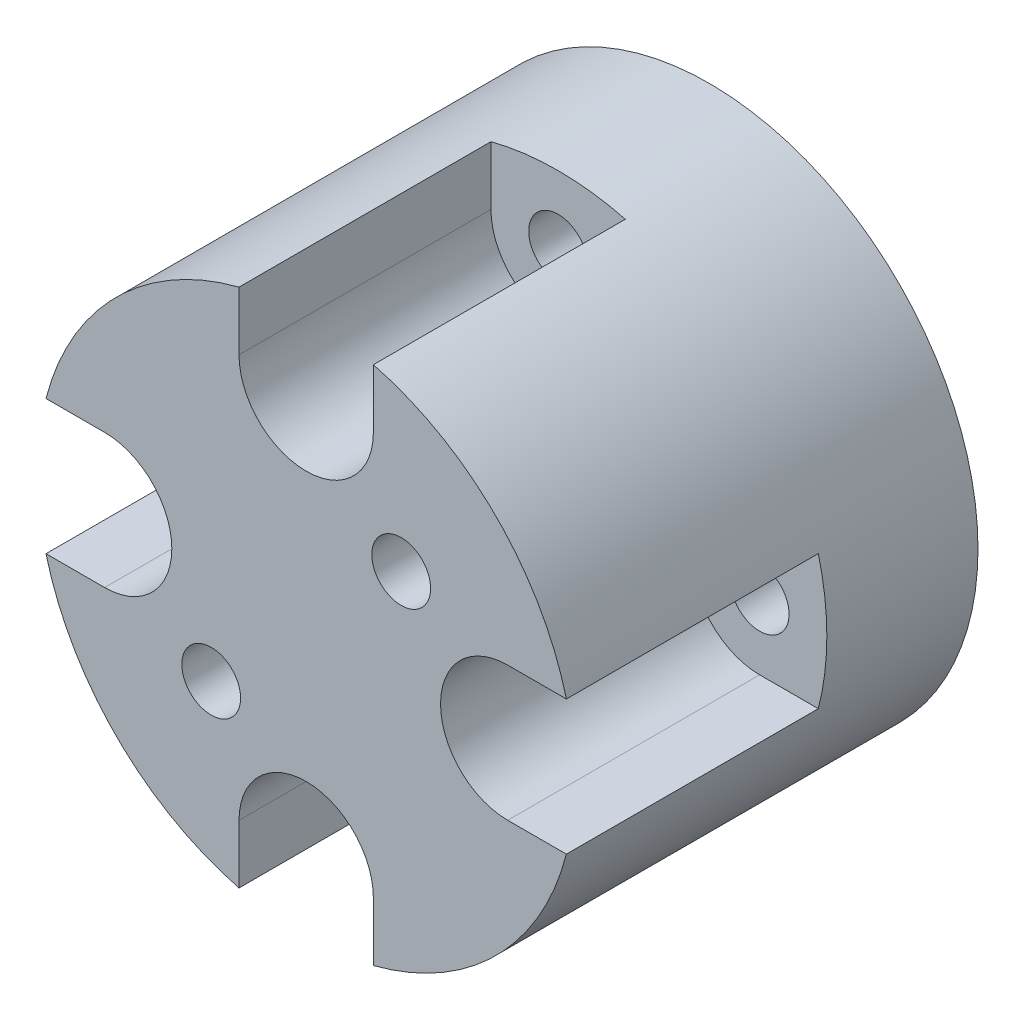
ISO-10303-21;
HEADER;
FILE_DESCRIPTION(('STEP AP214'),'2;1');
FILE_NAME('part.step','',(''),(''),'','','');
FILE_SCHEMA(('AUTOMOTIVE_DESIGN { 1 0 10303 214 1 1 1 1 }'));
ENDSEC;
DATA;
#1=APPLICATION_CONTEXT('core data for automotive mechanical design processes');
#2=APPLICATION_PROTOCOL_DEFINITION('international standard','automotive_design',2000,#1);
#3=PRODUCT_CONTEXT('',#1,'mechanical');
#4=PRODUCT('Part','Part','',(#3));
#5=PRODUCT_RELATED_PRODUCT_CATEGORY('part','',(#4));
#6=PRODUCT_DEFINITION_FORMATION('','',#4);
#7=PRODUCT_DEFINITION_CONTEXT('part definition',#1,'design');
#8=PRODUCT_DEFINITION('design','',#6,#7);
#9=PRODUCT_DEFINITION_SHAPE('','',#8);
#10=(LENGTH_UNIT() NAMED_UNIT(*) SI_UNIT(.MILLI.,.METRE.));
#11=(NAMED_UNIT(*) PLANE_ANGLE_UNIT() SI_UNIT($,.RADIAN.));
#12=(NAMED_UNIT(*) SI_UNIT($,.STERADIAN.) SOLID_ANGLE_UNIT());
#13=UNCERTAINTY_MEASURE_WITH_UNIT(LENGTH_MEASURE(1.E-05),#10,'distance_accuracy_value','');
#14=(GEOMETRIC_REPRESENTATION_CONTEXT(3) GLOBAL_UNCERTAINTY_ASSIGNED_CONTEXT((#13)) GLOBAL_UNIT_ASSIGNED_CONTEXT((#10,
#11,#12)) REPRESENTATION_CONTEXT('',''));
#15=CARTESIAN_POINT('',(0.,0.,0.));
#16=DIRECTION('',(0.,0.,1.));
#17=DIRECTION('',(1.,0.,0.));
#18=AXIS2_PLACEMENT_3D('',#15,#16,#17);
#19=CARTESIAN_POINT('',(0.,12.,24.));
#20=DIRECTION('',(0.,0.,-1.));
#21=DIRECTION('',(-1.,0.,0.));
#22=AXIS2_PLACEMENT_3D('',#19,#20,#21);
#23=CYLINDRICAL_SURFACE('',#22,1.75);
#24=CARTESIAN_POINT('',(0.,12.,0.));
#25=DIRECTION('',(0.,0.,1.));
#26=DIRECTION('',(1.,0.,0.));
#27=AXIS2_PLACEMENT_3D('',#24,#25,#26);
#28=CIRCLE('',#27,1.75);
#29=CARTESIAN_POINT('',(1.75,12.,0.));
#30=VERTEX_POINT('',#29);
#31=EDGE_CURVE('E275',#30,#30,#28,.T.);
#32=ORIENTED_EDGE('',*,*,#31,.F.);
#33=EDGE_LOOP('',(#32));
#34=FACE_BOUND('',#33,.T.);
#35=CARTESIAN_POINT('',(0.,12.,9.));
#36=DIRECTION('',(0.,0.,1.));
#37=DIRECTION('',(1.,0.,0.));
#38=AXIS2_PLACEMENT_3D('',#35,#36,#37);
#39=CIRCLE('',#38,1.75);
#40=CARTESIAN_POINT('',(1.75,12.,9.));
#41=VERTEX_POINT('',#40);
#42=EDGE_CURVE('E243',#41,#41,#39,.T.);
#43=ORIENTED_EDGE('',*,*,#42,.T.);
#44=EDGE_LOOP('',(#43));
#45=FACE_BOUND('',#44,.T.);
#46=ADVANCED_FACE('F37',(#34,#45),#23,.F.);
#47=CARTESIAN_POINT('',(12.,0.,24.));
#48=DIRECTION('',(0.,0.,-1.));
#49=DIRECTION('',(-1.,0.,0.));
#50=AXIS2_PLACEMENT_3D('',#47,#48,#49);
#51=CYLINDRICAL_SURFACE('',#50,1.75);
#52=CARTESIAN_POINT('',(12.,0.,0.));
#53=DIRECTION('',(0.,0.,1.));
#54=DIRECTION('',(1.,0.,0.));
#55=AXIS2_PLACEMENT_3D('',#52,#53,#54);
#56=CIRCLE('',#55,1.75);
#57=CARTESIAN_POINT('',(13.75,0.,0.));
#58=VERTEX_POINT('',#57);
#59=EDGE_CURVE('E272',#58,#58,#56,.T.);
#60=ORIENTED_EDGE('',*,*,#59,.F.);
#61=EDGE_LOOP('',(#60));
#62=FACE_BOUND('',#61,.T.);
#63=CARTESIAN_POINT('',(12.,0.,9.));
#64=DIRECTION('',(0.,0.,1.));
#65=DIRECTION('',(1.,0.,0.));
#66=AXIS2_PLACEMENT_3D('',#63,#64,#65);
#67=CIRCLE('',#66,1.75);
#68=CARTESIAN_POINT('',(13.75,0.,9.));
#69=VERTEX_POINT('',#68);
#70=EDGE_CURVE('E240',#69,#69,#67,.T.);
#71=ORIENTED_EDGE('',*,*,#70,.T.);
#72=EDGE_LOOP('',(#71));
#73=FACE_BOUND('',#72,.T.);
#74=ADVANCED_FACE('F386',(#62,#73),#51,.F.);
#75=CARTESIAN_POINT('',(-12.,0.,24.));
#76=DIRECTION('',(0.,0.,-1.));
#77=DIRECTION('',(-1.,0.,0.));
#78=AXIS2_PLACEMENT_3D('',#75,#76,#77);
#79=CYLINDRICAL_SURFACE('',#78,1.75);
#80=CARTESIAN_POINT('',(-12.,0.,0.));
#81=DIRECTION('',(0.,0.,1.));
#82=DIRECTION('',(-1.,0.,0.));
#83=AXIS2_PLACEMENT_3D('',#80,#81,#82);
#84=CIRCLE('',#83,1.75);
#85=CARTESIAN_POINT('',(-13.75,0.,0.));
#86=VERTEX_POINT('',#85);
#87=EDGE_CURVE('E269',#86,#86,#84,.T.);
#88=ORIENTED_EDGE('',*,*,#87,.F.);
#89=EDGE_LOOP('',(#88));
#90=FACE_BOUND('',#89,.T.);
#91=CARTESIAN_POINT('',(-12.,0.,9.));
#92=DIRECTION('',(0.,0.,1.));
#93=DIRECTION('',(1.,0.,0.));
#94=AXIS2_PLACEMENT_3D('',#91,#92,#93);
#95=CIRCLE('',#94,1.75);
#96=CARTESIAN_POINT('',(-10.25,0.,9.));
#97=VERTEX_POINT('',#96);
#98=EDGE_CURVE('E237',#97,#97,#95,.T.);
#99=ORIENTED_EDGE('',*,*,#98,.T.);
#100=EDGE_LOOP('',(#99));
#101=FACE_BOUND('',#100,.T.);
#102=ADVANCED_FACE('F392',(#90,#101),#79,.F.);
#103=CARTESIAN_POINT('',(0.,-12.,24.));
#104=DIRECTION('',(0.,0.,-1.));
#105=DIRECTION('',(-1.,0.,0.));
#106=AXIS2_PLACEMENT_3D('',#103,#104,#105);
#107=CYLINDRICAL_SURFACE('',#106,1.75);
#108=CARTESIAN_POINT('',(0.,-12.,0.));
#109=DIRECTION('',(0.,0.,1.));
#110=DIRECTION('',(-1.,0.,0.));
#111=AXIS2_PLACEMENT_3D('',#108,#109,#110);
#112=CIRCLE('',#111,1.75);
#113=CARTESIAN_POINT('',(-1.75,-12.,0.));
#114=VERTEX_POINT('',#113);
#115=EDGE_CURVE('E262',#114,#114,#112,.T.);
#116=ORIENTED_EDGE('',*,*,#115,.F.);
#117=EDGE_LOOP('',(#116));
#118=FACE_BOUND('',#117,.T.);
#119=CARTESIAN_POINT('',(0.,-12.,9.));
#120=DIRECTION('',(0.,0.,1.));
#121=DIRECTION('',(1.,0.,0.));
#122=AXIS2_PLACEMENT_3D('',#119,#120,#121);
#123=CIRCLE('',#122,1.75);
#124=CARTESIAN_POINT('',(1.75,-12.,9.));
#125=VERTEX_POINT('',#124);
#126=EDGE_CURVE('E179',#125,#125,#123,.T.);
#127=ORIENTED_EDGE('',*,*,#126,.T.);
#128=EDGE_LOOP('',(#127));
#129=FACE_BOUND('',#128,.T.);
#130=ADVANCED_FACE('F421',(#118,#129),#107,.F.);
#131=CARTESIAN_POINT('',(-5.65685424949241,-5.65685424949235,24.));
#132=DIRECTION('',(0.,0.,-1.));
#133=DIRECTION('',(-1.,0.,0.));
#134=AXIS2_PLACEMENT_3D('',#131,#132,#133);
#135=CYLINDRICAL_SURFACE('',#134,1.75);
#136=CARTESIAN_POINT('',(-5.65685424949241,-5.65685424949235,24.));
#137=DIRECTION('',(0.,0.,-1.));
#138=DIRECTION('',(1.,0.,0.));
#139=AXIS2_PLACEMENT_3D('',#136,#137,#138);
#140=CIRCLE('',#139,1.75);
#141=CARTESIAN_POINT('',(-3.90685424949241,-5.65685424949235,24.));
#142=VERTEX_POINT('',#141);
#143=EDGE_CURVE('E263',#142,#142,#140,.T.);
#144=ORIENTED_EDGE('',*,*,#143,.F.);
#145=EDGE_LOOP('',(#144));
#146=FACE_BOUND('',#145,.T.);
#147=CARTESIAN_POINT('',(-5.65685424949241,-5.65685424949235,15.));
#148=DIRECTION('',(0.,0.,-1.));
#149=DIRECTION('',(-1.,0.,0.));
#150=AXIS2_PLACEMENT_3D('',#147,#148,#149);
#151=CIRCLE('',#150,1.75);
#152=CARTESIAN_POINT('',(-7.40685424949241,-5.65685424949235,15.));
#153=VERTEX_POINT('',#152);
#154=EDGE_CURVE('E266',#153,#153,#151,.F.);
#155=ORIENTED_EDGE('',*,*,#154,.F.);
#156=EDGE_LOOP('',(#155));
#157=FACE_BOUND('',#156,.T.);
#158=ADVANCED_FACE('F424',(#146,#157),#135,.F.);
#159=CARTESIAN_POINT('',(5.65685424949241,5.65685424949235,24.));
#160=DIRECTION('',(0.,0.,-1.));
#161=DIRECTION('',(-1.,0.,0.));
#162=AXIS2_PLACEMENT_3D('',#159,#160,#161);
#163=CYLINDRICAL_SURFACE('',#162,1.75);
#164=CARTESIAN_POINT('',(5.65685424949241,5.65685424949235,24.));
#165=DIRECTION('',(0.,0.,-1.));
#166=DIRECTION('',(-1.,0.,0.));
#167=AXIS2_PLACEMENT_3D('',#164,#165,#166);
#168=CIRCLE('',#167,1.75);
#169=CARTESIAN_POINT('',(3.90685424949241,5.65685424949235,24.));
#170=VERTEX_POINT('',#169);
#171=EDGE_CURVE('E259',#170,#170,#168,.T.);
#172=ORIENTED_EDGE('',*,*,#171,.F.);
#173=EDGE_LOOP('',(#172));
#174=FACE_BOUND('',#173,.T.);
#175=CARTESIAN_POINT('',(5.65685424949241,5.65685424949235,15.));
#176=DIRECTION('',(0.,0.,-1.));
#177=DIRECTION('',(-1.,0.,0.));
#178=AXIS2_PLACEMENT_3D('',#175,#176,#177);
#179=CIRCLE('',#178,1.75);
#180=CARTESIAN_POINT('',(3.90685424949241,5.65685424949235,15.));
#181=VERTEX_POINT('',#180);
#182=EDGE_CURVE('E250',#181,#181,#179,.F.);
#183=ORIENTED_EDGE('',*,*,#182,.F.);
#184=EDGE_LOOP('',(#183));
#185=FACE_BOUND('',#184,.T.);
#186=ADVANCED_FACE('F401',(#174,#185),#163,.F.);
#187=CARTESIAN_POINT('',(0.,0.,24.));
#188=DIRECTION('',(0.,0.,1.));
#189=DIRECTION('',(1.,0.,0.));
#190=AXIS2_PLACEMENT_3D('',#187,#188,#189);
#191=PLANE('',#190);
#192=DIRECTION('',(0.,-1.,0.));
#193=VECTOR('',#192,1.);
#194=CARTESIAN_POINT('',(-4.,12.,24.));
#195=LINE('',#194,#193);
#196=CARTESIAN_POINT('',(-4.,15.4919333848297,24.));
#197=VERTEX_POINT('',#196);
#198=CARTESIAN_POINT('',(-4.,12.,24.));
#199=VERTEX_POINT('',#198);
#200=EDGE_CURVE('E170',#197,#199,#195,.T.);
#201=ORIENTED_EDGE('',*,*,#200,.F.);
#202=CARTESIAN_POINT('',(0.,0.,24.));
#203=DIRECTION('',(0.,0.,1.));
#204=DIRECTION('',(1.,0.,0.));
#205=AXIS2_PLACEMENT_3D('',#202,#203,#204);
#206=CIRCLE('',#205,16.);
#207=CARTESIAN_POINT('',(-15.4919333848297,4.,24.));
#208=VERTEX_POINT('',#207);
#209=EDGE_CURVE('E283',#197,#208,#206,.T.);
#210=ORIENTED_EDGE('',*,*,#209,.T.);
#211=DIRECTION('',(-1.,0.,0.));
#212=VECTOR('',#211,1.);
#213=CARTESIAN_POINT('',(-12.,4.,24.));
#214=LINE('',#213,#212);
#215=CARTESIAN_POINT('',(-12.,4.,24.));
#216=VERTEX_POINT('',#215);
#217=EDGE_CURVE('E207',#216,#208,#214,.T.);
#218=ORIENTED_EDGE('',*,*,#217,.F.);
#219=CARTESIAN_POINT('',(-12.,0.,24.));
#220=DIRECTION('',(0.,0.,1.));
#221=DIRECTION('',(1.,0.,0.));
#222=AXIS2_PLACEMENT_3D('',#219,#220,#221);
#223=CIRCLE('',#222,4.);
#224=CARTESIAN_POINT('',(-12.,-4.,24.));
#225=VERTEX_POINT('',#224);
#226=EDGE_CURVE('E187',#225,#216,#223,.T.);
#227=ORIENTED_EDGE('',*,*,#226,.F.);
#228=DIRECTION('',(1.,0.,0.));
#229=VECTOR('',#228,1.);
#230=CARTESIAN_POINT('',(-20.86066391594,-4.,24.));
#231=LINE('',#230,#229);
#232=CARTESIAN_POINT('',(-15.4919333848297,-4.,24.));
#233=VERTEX_POINT('',#232);
#234=EDGE_CURVE('E205',#233,#225,#231,.T.);
#235=ORIENTED_EDGE('',*,*,#234,.F.);
#236=CARTESIAN_POINT('',(-4.,-15.4919333848297,24.));
#237=VERTEX_POINT('',#236);
#238=EDGE_CURVE('E340',#233,#237,#206,.T.);
#239=ORIENTED_EDGE('',*,*,#238,.T.);
#240=DIRECTION('',(0.,-1.,0.));
#241=VECTOR('',#240,1.);
#242=CARTESIAN_POINT('',(-4.,-12.,24.));
#243=LINE('',#242,#241);
#244=CARTESIAN_POINT('',(-4.,-12.,24.));
#245=VERTEX_POINT('',#244);
#246=EDGE_CURVE('E225',#245,#237,#243,.T.);
#247=ORIENTED_EDGE('',*,*,#246,.F.);
#248=CARTESIAN_POINT('',(0.,-12.,24.));
#249=DIRECTION('',(0.,0.,1.));
#250=DIRECTION('',(1.,0.,0.));
#251=AXIS2_PLACEMENT_3D('',#248,#249,#250);
#252=CIRCLE('',#251,4.);
#253=CARTESIAN_POINT('',(4.,-12.,24.));
#254=VERTEX_POINT('',#253);
#255=EDGE_CURVE('E204',#254,#245,#252,.T.);
#256=ORIENTED_EDGE('',*,*,#255,.F.);
#257=DIRECTION('',(0.,1.,0.));
#258=VECTOR('',#257,1.);
#259=CARTESIAN_POINT('',(4.,-17.6097461429467,24.));
#260=LINE('',#259,#258);
#261=CARTESIAN_POINT('',(4.,-15.4919333848297,24.));
#262=VERTEX_POINT('',#261);
#263=EDGE_CURVE('E223',#262,#254,#260,.T.);
#264=ORIENTED_EDGE('',*,*,#263,.F.);
#265=CARTESIAN_POINT('',(15.4919333848297,-4.,24.));
#266=VERTEX_POINT('',#265);
#267=EDGE_CURVE('E284',#262,#266,#206,.T.);
#268=ORIENTED_EDGE('',*,*,#267,.T.);
#269=DIRECTION('',(1.,0.,0.));
#270=VECTOR('',#269,1.);
#271=CARTESIAN_POINT('',(20.3197858187912,-4.,24.));
#272=LINE('',#271,#270);
#273=CARTESIAN_POINT('',(12.,-4.,24.));
#274=VERTEX_POINT('',#273);
#275=EDGE_CURVE('E190',#274,#266,#272,.T.);
#276=ORIENTED_EDGE('',*,*,#275,.F.);
#277=CARTESIAN_POINT('',(12.,0.,24.));
#278=DIRECTION('',(0.,0.,1.));
#279=DIRECTION('',(1.,0.,0.));
#280=AXIS2_PLACEMENT_3D('',#277,#278,#279);
#281=CIRCLE('',#280,4.);
#282=CARTESIAN_POINT('',(12.,4.,24.));
#283=VERTEX_POINT('',#282);
#284=EDGE_CURVE('E177',#283,#274,#281,.T.);
#285=ORIENTED_EDGE('',*,*,#284,.F.);
#286=DIRECTION('',(-1.,0.,0.));
#287=VECTOR('',#286,1.);
#288=CARTESIAN_POINT('',(12.,4.,24.));
#289=LINE('',#288,#287);
#290=CARTESIAN_POINT('',(15.4919333848297,4.,24.));
#291=VERTEX_POINT('',#290);
#292=EDGE_CURVE('E188',#291,#283,#289,.T.);
#293=ORIENTED_EDGE('',*,*,#292,.F.);
#294=CARTESIAN_POINT('',(4.,15.4919333848297,24.));
#295=VERTEX_POINT('',#294);
#296=EDGE_CURVE('E279',#291,#295,#206,.T.);
#297=ORIENTED_EDGE('',*,*,#296,.T.);
#298=DIRECTION('',(0.,1.,0.));
#299=VECTOR('',#298,1.);
#300=CARTESIAN_POINT('',(4.,19.5275321632837,24.));
#301=LINE('',#300,#299);
#302=CARTESIAN_POINT('',(4.,12.,24.));
#303=VERTEX_POINT('',#302);
#304=EDGE_CURVE('E172',#303,#295,#301,.T.);
#305=ORIENTED_EDGE('',*,*,#304,.F.);
#306=CARTESIAN_POINT('',(0.,12.,24.));
#307=DIRECTION('',(0.,0.,1.));
#308=DIRECTION('',(1.,0.,0.));
#309=AXIS2_PLACEMENT_3D('',#306,#307,#308);
#310=CIRCLE('',#309,4.);
#311=EDGE_CURVE('E157',#199,#303,#310,.T.);
#312=ORIENTED_EDGE('',*,*,#311,.F.);
#313=EDGE_LOOP('',(#201,#210,#218,#227,#235,#239,#247,#256,#264,#268,#276,#285,#293,#297,#305,#312));
#314=FACE_BOUND('',#313,.T.);
#315=ORIENTED_EDGE('',*,*,#171,.T.);
#316=EDGE_LOOP('',(#315));
#317=FACE_BOUND('',#316,.T.);
#318=ORIENTED_EDGE('',*,*,#143,.T.);
#319=EDGE_LOOP('',(#318));
#320=FACE_BOUND('',#319,.T.);
#321=ADVANCED_FACE('F322',(#314,#317,#320),#191,.T.);
#322=CARTESIAN_POINT('',(0.,0.,0.));
#323=DIRECTION('',(0.,0.,1.));
#324=DIRECTION('',(1.,0.,0.));
#325=AXIS2_PLACEMENT_3D('',#322,#323,#324);
#326=PLANE('',#325);
#327=CARTESIAN_POINT('',(5.65685424949241,5.65685424949235,0.));
#328=DIRECTION('',(0.,0.,-1.));
#329=DIRECTION('',(-1.,0.,0.));
#330=AXIS2_PLACEMENT_3D('',#327,#328,#329);
#331=CIRCLE('',#330,4.);
#332=CARTESIAN_POINT('',(1.65685424949241,5.65685424949235,0.));
#333=VERTEX_POINT('',#332);
#334=EDGE_CURVE('E251',#333,#333,#331,.T.);
#335=ORIENTED_EDGE('',*,*,#334,.F.);
#336=EDGE_LOOP('',(#335));
#337=FACE_BOUND('',#336,.T.);
#338=CARTESIAN_POINT('',(-5.65685424949241,-5.65685424949235,0.));
#339=DIRECTION('',(0.,0.,-1.));
#340=DIRECTION('',(-1.,0.,0.));
#341=AXIS2_PLACEMENT_3D('',#338,#339,#340);
#342=CIRCLE('',#341,4.);
#343=CARTESIAN_POINT('',(-9.65685424949241,-5.65685424949235,0.));
#344=VERTEX_POINT('',#343);
#345=EDGE_CURVE('E254',#344,#344,#342,.T.);
#346=ORIENTED_EDGE('',*,*,#345,.F.);
#347=EDGE_LOOP('',(#346));
#348=FACE_BOUND('',#347,.T.);
#349=CARTESIAN_POINT('',(0.,0.,0.));
#350=DIRECTION('',(0.,0.,1.));
#351=DIRECTION('',(1.,0.,0.));
#352=AXIS2_PLACEMENT_3D('',#349,#350,#351);
#353=CIRCLE('',#352,16.);
#354=CARTESIAN_POINT('',(16.,0.,0.));
#355=VERTEX_POINT('',#354);
#356=EDGE_CURVE('E278',#355,#355,#353,.T.);
#357=ORIENTED_EDGE('',*,*,#356,.F.);
#358=EDGE_LOOP('',(#357));
#359=FACE_BOUND('',#358,.T.);
#360=ORIENTED_EDGE('',*,*,#31,.T.);
#361=EDGE_LOOP('',(#360));
#362=FACE_BOUND('',#361,.T.);
#363=ORIENTED_EDGE('',*,*,#59,.T.);
#364=EDGE_LOOP('',(#363));
#365=FACE_BOUND('',#364,.T.);
#366=ORIENTED_EDGE('',*,*,#87,.T.);
#367=EDGE_LOOP('',(#366));
#368=FACE_BOUND('',#367,.T.);
#369=ORIENTED_EDGE('',*,*,#115,.T.);
#370=EDGE_LOOP('',(#369));
#371=FACE_BOUND('',#370,.T.);
#372=ADVANCED_FACE('F400',(#337,#348,#359,#362,#365,#368,#371),#326,.F.);
#373=CARTESIAN_POINT('',(0.,0.,24.));
#374=DIRECTION('',(0.,0.,-1.));
#375=DIRECTION('',(-1.,0.,0.));
#376=AXIS2_PLACEMENT_3D('',#373,#374,#375);
#377=CYLINDRICAL_SURFACE('',#376,16.);
#378=ORIENTED_EDGE('',*,*,#209,.F.);
#379=DIRECTION('',(0.,0.,-1.));
#380=VECTOR('',#379,1.);
#381=CARTESIAN_POINT('',(-4.,15.4919333848297,24.));
#382=LINE('',#381,#380);
#383=CARTESIAN_POINT('',(-4.,15.4919333848297,9.));
#384=VERTEX_POINT('',#383);
#385=EDGE_CURVE('E11',#197,#384,#382,.T.);
#386=ORIENTED_EDGE('',*,*,#385,.T.);
#387=CARTESIAN_POINT('',(0.,0.,9.));
#388=DIRECTION('',(0.,0.,1.));
#389=DIRECTION('',(1.,0.,0.));
#390=AXIS2_PLACEMENT_3D('',#387,#388,#389);
#391=CIRCLE('',#390,16.);
#392=CARTESIAN_POINT('',(4.,15.4919333848297,9.));
#393=VERTEX_POINT('',#392);
#394=EDGE_CURVE('E244',#393,#384,#391,.T.);
#395=ORIENTED_EDGE('',*,*,#394,.F.);
#396=DIRECTION('',(0.,0.,-1.));
#397=VECTOR('',#396,1.);
#398=CARTESIAN_POINT('',(4.,15.4919333848297,24.));
#399=LINE('',#398,#397);
#400=EDGE_CURVE('E45',#393,#295,#399,.F.);
#401=ORIENTED_EDGE('',*,*,#400,.T.);
#402=ORIENTED_EDGE('',*,*,#296,.F.);
#403=DIRECTION('',(0.,0.,-1.));
#404=VECTOR('',#403,1.);
#405=CARTESIAN_POINT('',(15.4919333848297,4.,24.));
#406=LINE('',#405,#404);
#407=CARTESIAN_POINT('',(15.4919333848297,4.,9.));
#408=VERTEX_POINT('',#407);
#409=EDGE_CURVE('E313',#291,#408,#406,.T.);
#410=ORIENTED_EDGE('',*,*,#409,.T.);
#411=CARTESIAN_POINT('',(0.,0.,9.));
#412=DIRECTION('',(0.,0.,1.));
#413=DIRECTION('',(1.,0.,0.));
#414=AXIS2_PLACEMENT_3D('',#411,#412,#413);
#415=CIRCLE('',#414,16.);
#416=CARTESIAN_POINT('',(15.4919333848297,-4.,9.));
#417=VERTEX_POINT('',#416);
#418=EDGE_CURVE('E241',#417,#408,#415,.T.);
#419=ORIENTED_EDGE('',*,*,#418,.F.);
#420=DIRECTION('',(0.,0.,-1.));
#421=VECTOR('',#420,1.);
#422=CARTESIAN_POINT('',(15.4919333848297,-4.,24.));
#423=LINE('',#422,#421);
#424=EDGE_CURVE('E310',#417,#266,#423,.F.);
#425=ORIENTED_EDGE('',*,*,#424,.T.);
#426=ORIENTED_EDGE('',*,*,#267,.F.);
#427=DIRECTION('',(0.,0.,-1.));
#428=VECTOR('',#427,1.);
#429=CARTESIAN_POINT('',(4.,-15.4919333848297,24.));
#430=LINE('',#429,#428);
#431=CARTESIAN_POINT('',(4.,-15.4919333848297,9.));
#432=VERTEX_POINT('',#431);
#433=EDGE_CURVE('E301',#262,#432,#430,.T.);
#434=ORIENTED_EDGE('',*,*,#433,.T.);
#435=CARTESIAN_POINT('',(0.,0.,9.));
#436=DIRECTION('',(0.,0.,1.));
#437=DIRECTION('',(1.,0.,0.));
#438=AXIS2_PLACEMENT_3D('',#435,#436,#437);
#439=CIRCLE('',#438,16.);
#440=CARTESIAN_POINT('',(-4.,-15.4919333848297,9.));
#441=VERTEX_POINT('',#440);
#442=EDGE_CURVE('E235',#441,#432,#439,.T.);
#443=ORIENTED_EDGE('',*,*,#442,.F.);
#444=DIRECTION('',(0.,0.,-1.));
#445=VECTOR('',#444,1.);
#446=CARTESIAN_POINT('',(-4.,-15.4919333848297,24.));
#447=LINE('',#446,#445);
#448=EDGE_CURVE('E282',#441,#237,#447,.F.);
#449=ORIENTED_EDGE('',*,*,#448,.T.);
#450=ORIENTED_EDGE('',*,*,#238,.F.);
#451=DIRECTION('',(0.,0.,-1.));
#452=VECTOR('',#451,1.);
#453=CARTESIAN_POINT('',(-15.4919333848297,-4.,24.));
#454=LINE('',#453,#452);
#455=CARTESIAN_POINT('',(-15.4919333848297,-4.,9.));
#456=VERTEX_POINT('',#455);
#457=EDGE_CURVE('E307',#233,#456,#454,.T.);
#458=ORIENTED_EDGE('',*,*,#457,.T.);
#459=CARTESIAN_POINT('',(0.,0.,9.));
#460=DIRECTION('',(0.,0.,1.));
#461=DIRECTION('',(1.,0.,0.));
#462=AXIS2_PLACEMENT_3D('',#459,#460,#461);
#463=CIRCLE('',#462,16.);
#464=CARTESIAN_POINT('',(-15.4919333848297,4.,9.));
#465=VERTEX_POINT('',#464);
#466=EDGE_CURVE('E238',#465,#456,#463,.T.);
#467=ORIENTED_EDGE('',*,*,#466,.F.);
#468=DIRECTION('',(0.,0.,-1.));
#469=VECTOR('',#468,1.);
#470=CARTESIAN_POINT('',(-15.4919333848297,4.,24.));
#471=LINE('',#470,#469);
#472=EDGE_CURVE('E304',#465,#208,#471,.F.);
#473=ORIENTED_EDGE('',*,*,#472,.T.);
#474=EDGE_LOOP('',(#378,#386,#395,#401,#402,#410,#419,#425,#426,#434,#443,#449,#450,#458,#467,#473));
#475=FACE_BOUND('',#474,.T.);
#476=ORIENTED_EDGE('',*,*,#356,.T.);
#477=EDGE_LOOP('',(#476));
#478=FACE_BOUND('',#477,.T.);
#479=ADVANCED_FACE('F39',(#475,#478),#377,.T.);
#480=CARTESIAN_POINT('',(5.65685424949241,5.65685424949235,15.));
#481=DIRECTION('',(0.,0.,-1.));
#482=DIRECTION('',(-1.,0.,0.));
#483=AXIS2_PLACEMENT_3D('',#480,#481,#482);
#484=PLANE('',#483);
#485=CARTESIAN_POINT('',(5.65685424949241,5.65685424949235,15.));
#486=DIRECTION('',(0.,0.,-1.));
#487=DIRECTION('',(-1.,0.,0.));
#488=AXIS2_PLACEMENT_3D('',#485,#486,#487);
#489=CIRCLE('',#488,4.);
#490=CARTESIAN_POINT('',(1.65685424949241,5.65685424949235,15.));
#491=VERTEX_POINT('',#490);
#492=EDGE_CURVE('E247',#491,#491,#489,.T.);
#493=ORIENTED_EDGE('',*,*,#492,.T.);
#494=EDGE_LOOP('',(#493));
#495=FACE_BOUND('',#494,.T.);
#496=ORIENTED_EDGE('',*,*,#182,.T.);
#497=EDGE_LOOP('',(#496));
#498=FACE_BOUND('',#497,.T.);
#499=ADVANCED_FACE('F407',(#495,#498),#484,.T.);
#500=CARTESIAN_POINT('',(5.65685424949241,5.65685424949235,15.));
#501=DIRECTION('',(0.,0.,-1.));
#502=DIRECTION('',(-1.,0.,0.));
#503=AXIS2_PLACEMENT_3D('',#500,#501,#502);
#504=CYLINDRICAL_SURFACE('',#503,4.);
#505=ORIENTED_EDGE('',*,*,#492,.F.);
#506=EDGE_LOOP('',(#505));
#507=FACE_BOUND('',#506,.T.);
#508=ORIENTED_EDGE('',*,*,#334,.T.);
#509=EDGE_LOOP('',(#508));
#510=FACE_BOUND('',#509,.T.);
#511=ADVANCED_FACE('F441',(#507,#510),#504,.F.);
#512=CARTESIAN_POINT('',(-5.65685424949241,-5.65685424949235,15.));
#513=DIRECTION('',(0.,0.,-1.));
#514=DIRECTION('',(-1.,0.,0.));
#515=AXIS2_PLACEMENT_3D('',#512,#513,#514);
#516=PLANE('',#515);
#517=CARTESIAN_POINT('',(-5.65685424949241,-5.65685424949235,15.));
#518=DIRECTION('',(0.,0.,-1.));
#519=DIRECTION('',(-1.,0.,0.));
#520=AXIS2_PLACEMENT_3D('',#517,#518,#519);
#521=CIRCLE('',#520,4.);
#522=CARTESIAN_POINT('',(-9.65685424949241,-5.65685424949235,15.));
#523=VERTEX_POINT('',#522);
#524=EDGE_CURVE('E246',#523,#523,#521,.T.);
#525=ORIENTED_EDGE('',*,*,#524,.T.);
#526=EDGE_LOOP('',(#525));
#527=FACE_BOUND('',#526,.T.);
#528=ORIENTED_EDGE('',*,*,#154,.T.);
#529=EDGE_LOOP('',(#528));
#530=FACE_BOUND('',#529,.T.);
#531=ADVANCED_FACE('F437',(#527,#530),#516,.T.);
#532=CARTESIAN_POINT('',(-5.65685424949241,-5.65685424949235,15.));
#533=DIRECTION('',(0.,0.,-1.));
#534=DIRECTION('',(-1.,0.,0.));
#535=AXIS2_PLACEMENT_3D('',#532,#533,#534);
#536=CYLINDRICAL_SURFACE('',#535,4.);
#537=ORIENTED_EDGE('',*,*,#524,.F.);
#538=EDGE_LOOP('',(#537));
#539=FACE_BOUND('',#538,.T.);
#540=ORIENTED_EDGE('',*,*,#345,.T.);
#541=EDGE_LOOP('',(#540));
#542=FACE_BOUND('',#541,.T.);
#543=ADVANCED_FACE('F440',(#539,#542),#536,.F.);
#544=CARTESIAN_POINT('',(4.,-17.6097461429467,9.));
#545=DIRECTION('',(1.,0.,0.));
#546=DIRECTION('',(0.,0.,-1.));
#547=AXIS2_PLACEMENT_3D('',#544,#545,#546);
#548=PLANE('',#547);
#549=ORIENTED_EDGE('',*,*,#263,.T.);
#550=DIRECTION('',(0.,0.,1.));
#551=VECTOR('',#550,1.);
#552=CARTESIAN_POINT('',(4.,-12.,9.));
#553=LINE('',#552,#551);
#554=CARTESIAN_POINT('',(4.,-12.,9.));
#555=VERTEX_POINT('',#554);
#556=EDGE_CURVE('E220',#555,#254,#553,.T.);
#557=ORIENTED_EDGE('',*,*,#556,.F.);
#558=DIRECTION('',(0.,1.,0.));
#559=VECTOR('',#558,1.);
#560=CARTESIAN_POINT('',(4.,-17.6097461429467,9.));
#561=LINE('',#560,#559);
#562=EDGE_CURVE('E219',#432,#555,#561,.T.);
#563=ORIENTED_EDGE('',*,*,#562,.F.);
#564=ORIENTED_EDGE('',*,*,#433,.F.);
#565=EDGE_LOOP('',(#549,#557,#563,#564));
#566=FACE_BOUND('',#565,.T.);
#567=ADVANCED_FACE('F369',(#566),#548,.F.);
#568=CARTESIAN_POINT('',(-4.,-12.,9.));
#569=DIRECTION('',(-1.,0.,0.));
#570=DIRECTION('',(0.,0.,1.));
#571=AXIS2_PLACEMENT_3D('',#568,#569,#570);
#572=PLANE('',#571);
#573=DIRECTION('',(0.,-1.,0.));
#574=VECTOR('',#573,1.);
#575=CARTESIAN_POINT('',(-4.,-12.,9.));
#576=LINE('',#575,#574);
#577=CARTESIAN_POINT('',(-4.,-12.,9.));
#578=VERTEX_POINT('',#577);
#579=EDGE_CURVE('E231',#578,#441,#576,.T.);
#580=ORIENTED_EDGE('',*,*,#579,.F.);
#581=DIRECTION('',(0.,0.,1.));
#582=VECTOR('',#581,1.);
#583=CARTESIAN_POINT('',(-4.,-12.,9.));
#584=LINE('',#583,#582);
#585=EDGE_CURVE('E217',#578,#245,#584,.T.);
#586=ORIENTED_EDGE('',*,*,#585,.T.);
#587=ORIENTED_EDGE('',*,*,#246,.T.);
#588=ORIENTED_EDGE('',*,*,#448,.F.);
#589=EDGE_LOOP('',(#580,#586,#587,#588));
#590=FACE_BOUND('',#589,.T.);
#591=ADVANCED_FACE('F362',(#590),#572,.F.);
#592=CARTESIAN_POINT('',(0.,-12.,9.));
#593=DIRECTION('',(0.,0.,1.));
#594=DIRECTION('',(1.,0.,0.));
#595=AXIS2_PLACEMENT_3D('',#592,#593,#594);
#596=PLANE('',#595);
#597=ORIENTED_EDGE('',*,*,#126,.F.);
#598=EDGE_LOOP('',(#597));
#599=FACE_BOUND('',#598,.T.);
#600=ORIENTED_EDGE('',*,*,#442,.T.);
#601=ORIENTED_EDGE('',*,*,#562,.T.);
#602=CARTESIAN_POINT('',(0.,-12.,9.));
#603=DIRECTION('',(0.,0.,1.));
#604=DIRECTION('',(1.,0.,0.));
#605=AXIS2_PLACEMENT_3D('',#602,#603,#604);
#606=CIRCLE('',#605,4.);
#607=EDGE_CURVE('E226',#555,#578,#606,.T.);
#608=ORIENTED_EDGE('',*,*,#607,.T.);
#609=ORIENTED_EDGE('',*,*,#579,.T.);
#610=EDGE_LOOP('',(#600,#601,#608,#609));
#611=FACE_BOUND('',#610,.T.);
#612=ADVANCED_FACE('F371',(#599,#611),#596,.T.);
#613=CARTESIAN_POINT('',(0.,-12.,9.));
#614=DIRECTION('',(0.,0.,1.));
#615=DIRECTION('',(1.,0.,0.));
#616=AXIS2_PLACEMENT_3D('',#613,#614,#615);
#617=CYLINDRICAL_SURFACE('',#616,4.);
#618=ORIENTED_EDGE('',*,*,#255,.T.);
#619=ORIENTED_EDGE('',*,*,#585,.F.);
#620=ORIENTED_EDGE('',*,*,#607,.F.);
#621=ORIENTED_EDGE('',*,*,#556,.T.);
#622=EDGE_LOOP('',(#618,#619,#620,#621));
#623=FACE_BOUND('',#622,.T.);
#624=ADVANCED_FACE('F364',(#623),#617,.F.);
#625=CARTESIAN_POINT('',(-20.86066391594,-4.,9.));
#626=DIRECTION('',(0.,-1.,0.));
#627=DIRECTION('',(0.,0.,-1.));
#628=AXIS2_PLACEMENT_3D('',#625,#626,#627);
#629=PLANE('',#628);
#630=ORIENTED_EDGE('',*,*,#234,.T.);
#631=DIRECTION('',(0.,0.,1.));
#632=VECTOR('',#631,1.);
#633=CARTESIAN_POINT('',(-12.,-4.,9.));
#634=LINE('',#633,#632);
#635=CARTESIAN_POINT('',(-12.,-4.,9.));
#636=VERTEX_POINT('',#635);
#637=EDGE_CURVE('E201',#636,#225,#634,.T.);
#638=ORIENTED_EDGE('',*,*,#637,.F.);
#639=DIRECTION('',(1.,0.,0.));
#640=VECTOR('',#639,1.);
#641=CARTESIAN_POINT('',(-20.86066391594,-4.,9.));
#642=LINE('',#641,#640);
#643=EDGE_CURVE('E200',#456,#636,#642,.T.);
#644=ORIENTED_EDGE('',*,*,#643,.F.);
#645=ORIENTED_EDGE('',*,*,#457,.F.);
#646=EDGE_LOOP('',(#630,#638,#644,#645));
#647=FACE_BOUND('',#646,.T.);
#648=ADVANCED_FACE('F379',(#647),#629,.F.);
#649=CARTESIAN_POINT('',(-12.,4.,9.));
#650=DIRECTION('',(0.,1.,0.));
#651=DIRECTION('',(-1.,0.,0.));
#652=AXIS2_PLACEMENT_3D('',#649,#650,#651);
#653=PLANE('',#652);
#654=DIRECTION('',(-1.,0.,0.));
#655=VECTOR('',#654,1.);
#656=CARTESIAN_POINT('',(-12.,4.,9.));
#657=LINE('',#656,#655);
#658=CARTESIAN_POINT('',(-12.,4.,9.));
#659=VERTEX_POINT('',#658);
#660=EDGE_CURVE('E213',#659,#465,#657,.T.);
#661=ORIENTED_EDGE('',*,*,#660,.F.);
#662=DIRECTION('',(0.,0.,1.));
#663=VECTOR('',#662,1.);
#664=CARTESIAN_POINT('',(-12.,4.,9.));
#665=LINE('',#664,#663);
#666=EDGE_CURVE('E198',#659,#216,#665,.T.);
#667=ORIENTED_EDGE('',*,*,#666,.T.);
#668=ORIENTED_EDGE('',*,*,#217,.T.);
#669=ORIENTED_EDGE('',*,*,#472,.F.);
#670=EDGE_LOOP('',(#661,#667,#668,#669));
#671=FACE_BOUND('',#670,.T.);
#672=ADVANCED_FACE('F352',(#671),#653,.F.);
#673=CARTESIAN_POINT('',(-12.,0.,9.));
#674=DIRECTION('',(0.,0.,1.));
#675=DIRECTION('',(1.,0.,0.));
#676=AXIS2_PLACEMENT_3D('',#673,#674,#675);
#677=PLANE('',#676);
#678=ORIENTED_EDGE('',*,*,#98,.F.);
#679=EDGE_LOOP('',(#678));
#680=FACE_BOUND('',#679,.T.);
#681=ORIENTED_EDGE('',*,*,#466,.T.);
#682=ORIENTED_EDGE('',*,*,#643,.T.);
#683=CARTESIAN_POINT('',(-12.,0.,9.));
#684=DIRECTION('',(0.,0.,1.));
#685=DIRECTION('',(1.,0.,0.));
#686=AXIS2_PLACEMENT_3D('',#683,#684,#685);
#687=CIRCLE('',#686,4.);
#688=EDGE_CURVE('E208',#636,#659,#687,.T.);
#689=ORIENTED_EDGE('',*,*,#688,.T.);
#690=ORIENTED_EDGE('',*,*,#660,.T.);
#691=EDGE_LOOP('',(#681,#682,#689,#690));
#692=FACE_BOUND('',#691,.T.);
#693=ADVANCED_FACE('F511',(#680,#692),#677,.T.);
#694=CARTESIAN_POINT('',(-12.,0.,9.));
#695=DIRECTION('',(0.,0.,1.));
#696=DIRECTION('',(1.,0.,0.));
#697=AXIS2_PLACEMENT_3D('',#694,#695,#696);
#698=CYLINDRICAL_SURFACE('',#697,4.);
#699=ORIENTED_EDGE('',*,*,#226,.T.);
#700=ORIENTED_EDGE('',*,*,#666,.F.);
#701=ORIENTED_EDGE('',*,*,#688,.F.);
#702=ORIENTED_EDGE('',*,*,#637,.T.);
#703=EDGE_LOOP('',(#699,#700,#701,#702));
#704=FACE_BOUND('',#703,.T.);
#705=ADVANCED_FACE('F355',(#704),#698,.F.);
#706=CARTESIAN_POINT('',(12.,4.,9.));
#707=DIRECTION('',(0.,1.,0.));
#708=DIRECTION('',(0.,0.,1.));
#709=AXIS2_PLACEMENT_3D('',#706,#707,#708);
#710=PLANE('',#709);
#711=ORIENTED_EDGE('',*,*,#292,.T.);
#712=DIRECTION('',(0.,0.,1.));
#713=VECTOR('',#712,1.);
#714=CARTESIAN_POINT('',(12.,4.,9.));
#715=LINE('',#714,#713);
#716=CARTESIAN_POINT('',(12.,4.,9.));
#717=VERTEX_POINT('',#716);
#718=EDGE_CURVE('E184',#717,#283,#715,.T.);
#719=ORIENTED_EDGE('',*,*,#718,.F.);
#720=DIRECTION('',(-1.,0.,0.));
#721=VECTOR('',#720,1.);
#722=CARTESIAN_POINT('',(12.,4.,9.));
#723=LINE('',#722,#721);
#724=EDGE_CURVE('E183',#408,#717,#723,.T.);
#725=ORIENTED_EDGE('',*,*,#724,.F.);
#726=ORIENTED_EDGE('',*,*,#409,.F.);
#727=EDGE_LOOP('',(#711,#719,#725,#726));
#728=FACE_BOUND('',#727,.T.);
#729=ADVANCED_FACE('F328',(#728),#710,.F.);
#730=CARTESIAN_POINT('',(20.3197858187912,-4.,9.));
#731=DIRECTION('',(0.,-1.,0.));
#732=DIRECTION('',(0.,0.,-1.));
#733=AXIS2_PLACEMENT_3D('',#730,#731,#732);
#734=PLANE('',#733);
#735=DIRECTION('',(1.,0.,0.));
#736=VECTOR('',#735,1.);
#737=CARTESIAN_POINT('',(20.3197858187912,-4.,9.));
#738=LINE('',#737,#736);
#739=CARTESIAN_POINT('',(12.,-4.,9.));
#740=VERTEX_POINT('',#739);
#741=EDGE_CURVE('E60',#740,#417,#738,.T.);
#742=ORIENTED_EDGE('',*,*,#741,.F.);
#743=DIRECTION('',(0.,0.,1.));
#744=VECTOR('',#743,1.);
#745=CARTESIAN_POINT('',(12.,-4.,9.));
#746=LINE('',#745,#744);
#747=EDGE_CURVE('E181',#740,#274,#746,.T.);
#748=ORIENTED_EDGE('',*,*,#747,.T.);
#749=ORIENTED_EDGE('',*,*,#275,.T.);
#750=ORIENTED_EDGE('',*,*,#424,.F.);
#751=EDGE_LOOP('',(#742,#748,#749,#750));
#752=FACE_BOUND('',#751,.T.);
#753=ADVANCED_FACE('F540',(#752),#734,.F.);
#754=CARTESIAN_POINT('',(12.,0.,9.));
#755=DIRECTION('',(0.,0.,1.));
#756=DIRECTION('',(1.,0.,0.));
#757=AXIS2_PLACEMENT_3D('',#754,#755,#756);
#758=PLANE('',#757);
#759=ORIENTED_EDGE('',*,*,#70,.F.);
#760=EDGE_LOOP('',(#759));
#761=FACE_BOUND('',#760,.T.);
#762=ORIENTED_EDGE('',*,*,#418,.T.);
#763=ORIENTED_EDGE('',*,*,#724,.T.);
#764=CARTESIAN_POINT('',(12.,0.,9.));
#765=DIRECTION('',(0.,0.,1.));
#766=DIRECTION('',(1.,0.,0.));
#767=AXIS2_PLACEMENT_3D('',#764,#765,#766);
#768=CIRCLE('',#767,4.);
#769=EDGE_CURVE('E191',#717,#740,#768,.T.);
#770=ORIENTED_EDGE('',*,*,#769,.T.);
#771=ORIENTED_EDGE('',*,*,#741,.T.);
#772=EDGE_LOOP('',(#762,#763,#770,#771));
#773=FACE_BOUND('',#772,.T.);
#774=ADVANCED_FACE('F333',(#761,#773),#758,.T.);
#775=CARTESIAN_POINT('',(12.,0.,9.));
#776=DIRECTION('',(0.,0.,1.));
#777=DIRECTION('',(1.,0.,0.));
#778=AXIS2_PLACEMENT_3D('',#775,#776,#777);
#779=CYLINDRICAL_SURFACE('',#778,4.);
#780=ORIENTED_EDGE('',*,*,#284,.T.);
#781=ORIENTED_EDGE('',*,*,#747,.F.);
#782=ORIENTED_EDGE('',*,*,#769,.F.);
#783=ORIENTED_EDGE('',*,*,#718,.T.);
#784=EDGE_LOOP('',(#780,#781,#782,#783));
#785=FACE_BOUND('',#784,.T.);
#786=ADVANCED_FACE('F332',(#785),#779,.F.);
#787=CARTESIAN_POINT('',(-4.,12.,9.));
#788=DIRECTION('',(-1.,0.,0.));
#789=DIRECTION('',(0.,0.,1.));
#790=AXIS2_PLACEMENT_3D('',#787,#788,#789);
#791=PLANE('',#790);
#792=ORIENTED_EDGE('',*,*,#200,.T.);
#793=DIRECTION('',(0.,0.,1.));
#794=VECTOR('',#793,1.);
#795=CARTESIAN_POINT('',(-4.,12.,9.));
#796=LINE('',#795,#794);
#797=CARTESIAN_POINT('',(-4.,12.,9.));
#798=VERTEX_POINT('',#797);
#799=EDGE_CURVE('E160',#798,#199,#796,.T.);
#800=ORIENTED_EDGE('',*,*,#799,.F.);
#801=DIRECTION('',(0.,-1.,0.));
#802=VECTOR('',#801,1.);
#803=CARTESIAN_POINT('',(-4.,12.,9.));
#804=LINE('',#803,#802);
#805=EDGE_CURVE('E161',#384,#798,#804,.T.);
#806=ORIENTED_EDGE('',*,*,#805,.F.);
#807=ORIENTED_EDGE('',*,*,#385,.F.);
#808=EDGE_LOOP('',(#792,#800,#806,#807));
#809=FACE_BOUND('',#808,.T.);
#810=ADVANCED_FACE('F569',(#809),#791,.F.);
#811=CARTESIAN_POINT('',(4.,19.5275321632837,9.));
#812=DIRECTION('',(1.,0.,0.));
#813=DIRECTION('',(0.,0.,-1.));
#814=AXIS2_PLACEMENT_3D('',#811,#812,#813);
#815=PLANE('',#814);
#816=DIRECTION('',(0.,1.,0.));
#817=VECTOR('',#816,1.);
#818=CARTESIAN_POINT('',(4.,19.5275321632837,9.));
#819=LINE('',#818,#817);
#820=CARTESIAN_POINT('',(4.,12.,9.));
#821=VERTEX_POINT('',#820);
#822=EDGE_CURVE('E52',#821,#393,#819,.T.);
#823=ORIENTED_EDGE('',*,*,#822,.F.);
#824=DIRECTION('',(0.,0.,1.));
#825=VECTOR('',#824,1.);
#826=CARTESIAN_POINT('',(4.,12.,9.));
#827=LINE('',#826,#825);
#828=EDGE_CURVE('E152',#821,#303,#827,.T.);
#829=ORIENTED_EDGE('',*,*,#828,.T.);
#830=ORIENTED_EDGE('',*,*,#304,.T.);
#831=ORIENTED_EDGE('',*,*,#400,.F.);
#832=EDGE_LOOP('',(#823,#829,#830,#831));
#833=FACE_BOUND('',#832,.T.);
#834=ADVANCED_FACE('F163',(#833),#815,.F.);
#835=CARTESIAN_POINT('',(0.,12.,9.));
#836=DIRECTION('',(0.,0.,1.));
#837=DIRECTION('',(1.,0.,0.));
#838=AXIS2_PLACEMENT_3D('',#835,#836,#837);
#839=PLANE('',#838);
#840=ORIENTED_EDGE('',*,*,#42,.F.);
#841=EDGE_LOOP('',(#840));
#842=FACE_BOUND('',#841,.T.);
#843=ORIENTED_EDGE('',*,*,#394,.T.);
#844=ORIENTED_EDGE('',*,*,#805,.T.);
#845=CARTESIAN_POINT('',(0.,12.,9.));
#846=DIRECTION('',(0.,0.,1.));
#847=DIRECTION('',(1.,0.,0.));
#848=AXIS2_PLACEMENT_3D('',#845,#846,#847);
#849=CIRCLE('',#848,4.);
#850=EDGE_CURVE('E155',#798,#821,#849,.T.);
#851=ORIENTED_EDGE('',*,*,#850,.T.);
#852=ORIENTED_EDGE('',*,*,#822,.T.);
#853=EDGE_LOOP('',(#843,#844,#851,#852));
#854=FACE_BOUND('',#853,.T.);
#855=ADVANCED_FACE('F167',(#842,#854),#839,.T.);
#856=CARTESIAN_POINT('',(0.,12.,9.));
#857=DIRECTION('',(0.,0.,1.));
#858=DIRECTION('',(1.,0.,0.));
#859=AXIS2_PLACEMENT_3D('',#856,#857,#858);
#860=CYLINDRICAL_SURFACE('',#859,4.);
#861=ORIENTED_EDGE('',*,*,#311,.T.);
#862=ORIENTED_EDGE('',*,*,#828,.F.);
#863=ORIENTED_EDGE('',*,*,#850,.F.);
#864=ORIENTED_EDGE('',*,*,#799,.T.);
#865=EDGE_LOOP('',(#861,#862,#863,#864));
#866=FACE_BOUND('',#865,.T.);
#867=ADVANCED_FACE('F153',(#866),#860,.F.);
#868=CLOSED_SHELL('',(#46,#74,#102,#130,#158,#186,#321,#372,#479,#499,#511,#531,#543,#567,#591,
#612,#624,#648,#672,#693,#705,#729,#753,#774,#786,#810,#834,#855,#867));
#869=MANIFOLD_SOLID_BREP('B2',#868);
#870=ADVANCED_BREP_SHAPE_REPRESENTATION('',(#18,#869),#14);
#871=SHAPE_DEFINITION_REPRESENTATION(#9,#870);
ENDSEC;
END-ISO-10303-21;
